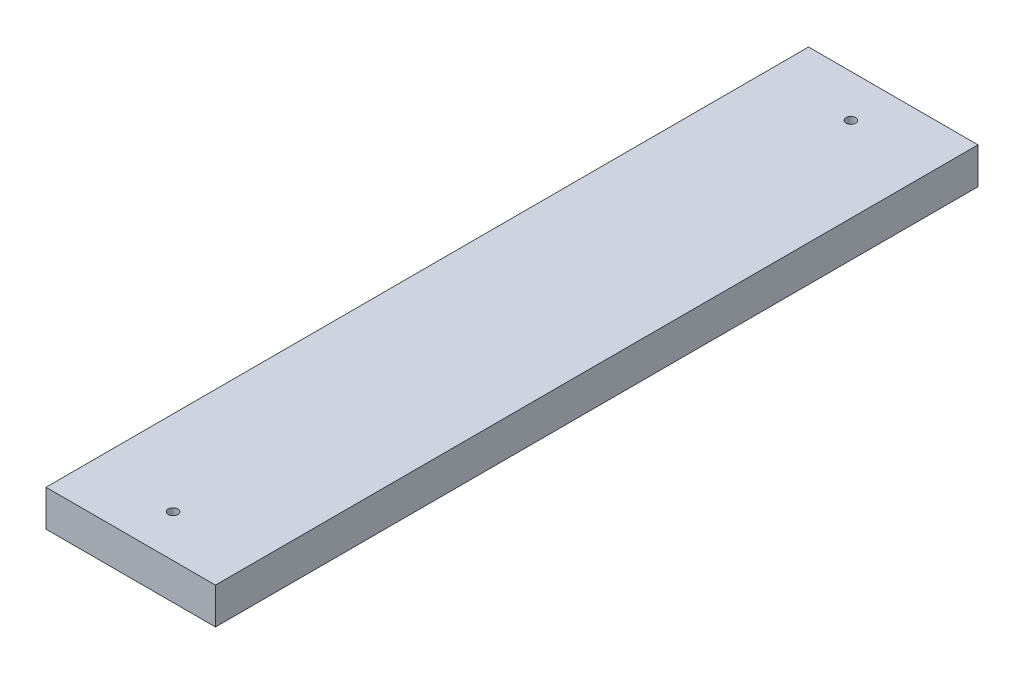
ISO-10303-21;
HEADER;
FILE_DESCRIPTION(('STEP AP214'),'2;1');
FILE_NAME('part.step','',(''),(''),'','','');
FILE_SCHEMA(('AUTOMOTIVE_DESIGN { 1 0 10303 214 1 1 1 1 }'));
ENDSEC;
DATA;
#1=APPLICATION_CONTEXT('core data for automotive mechanical design processes');
#2=APPLICATION_PROTOCOL_DEFINITION('international standard','automotive_design',2000,#1);
#3=PRODUCT_CONTEXT('',#1,'mechanical');
#4=PRODUCT('Part','Part','',(#3));
#5=PRODUCT_RELATED_PRODUCT_CATEGORY('part','',(#4));
#6=PRODUCT_DEFINITION_FORMATION('','',#4);
#7=PRODUCT_DEFINITION_CONTEXT('part definition',#1,'design');
#8=PRODUCT_DEFINITION('design','',#6,#7);
#9=PRODUCT_DEFINITION_SHAPE('','',#8);
#10=(LENGTH_UNIT() NAMED_UNIT(*) SI_UNIT(.MILLI.,.METRE.));
#11=(NAMED_UNIT(*) PLANE_ANGLE_UNIT() SI_UNIT($,.RADIAN.));
#12=(NAMED_UNIT(*) SI_UNIT($,.STERADIAN.) SOLID_ANGLE_UNIT());
#13=UNCERTAINTY_MEASURE_WITH_UNIT(LENGTH_MEASURE(1.E-05),#10,'distance_accuracy_value','');
#14=(GEOMETRIC_REPRESENTATION_CONTEXT(3) GLOBAL_UNCERTAINTY_ASSIGNED_CONTEXT((#13)) GLOBAL_UNIT_ASSIGNED_CONTEXT((#10,
#11,#12)) REPRESENTATION_CONTEXT('',''));
#15=CARTESIAN_POINT('',(0.,0.,0.));
#16=DIRECTION('',(0.,0.,1.));
#17=DIRECTION('',(1.,0.,0.));
#18=AXIS2_PLACEMENT_3D('',#15,#16,#17);
#19=CARTESIAN_POINT('',(0.,15.,0.));
#20=DIRECTION('',(0.,1.,0.));
#21=DIRECTION('',(0.,0.,1.));
#22=AXIS2_PLACEMENT_3D('',#19,#20,#21);
#23=PLANE('',#22);
#24=CARTESIAN_POINT('',(0.,15.,-140.));
#25=DIRECTION('',(0.,1.,0.));
#26=DIRECTION('',(0.,0.,1.));
#27=AXIS2_PLACEMENT_3D('',#24,#25,#26);
#28=CIRCLE('',#27,2.);
#29=CARTESIAN_POINT('',(0.,15.,-138.));
#30=VERTEX_POINT('',#29);
#31=EDGE_CURVE('E100',#30,#30,#28,.T.);
#32=ORIENTED_EDGE('',*,*,#31,.F.);
#33=EDGE_LOOP('',(#32));
#34=FACE_BOUND('',#33,.T.);
#35=DIRECTION('',(0.,0.,-1.));
#36=VECTOR('',#35,1.);
#37=CARTESIAN_POINT('',(35.,15.,-157.5));
#38=LINE('',#37,#36);
#39=CARTESIAN_POINT('',(35.,15.,157.5));
#40=VERTEX_POINT('',#39);
#41=CARTESIAN_POINT('',(35.,15.,-157.5));
#42=VERTEX_POINT('',#41);
#43=EDGE_CURVE('E85',#40,#42,#38,.T.);
#44=ORIENTED_EDGE('',*,*,#43,.T.);
#45=DIRECTION('',(-1.,0.,0.));
#46=VECTOR('',#45,1.);
#47=CARTESIAN_POINT('',(-35.,15.,-157.5));
#48=LINE('',#47,#46);
#49=CARTESIAN_POINT('',(-35.,15.,-157.5));
#50=VERTEX_POINT('',#49);
#51=EDGE_CURVE('E80',#42,#50,#48,.T.);
#52=ORIENTED_EDGE('',*,*,#51,.T.);
#53=DIRECTION('',(0.,0.,1.));
#54=VECTOR('',#53,1.);
#55=CARTESIAN_POINT('',(-35.,15.,-157.5));
#56=LINE('',#55,#54);
#57=CARTESIAN_POINT('',(-35.,15.,157.5));
#58=VERTEX_POINT('',#57);
#59=EDGE_CURVE('E83',#50,#58,#56,.T.);
#60=ORIENTED_EDGE('',*,*,#59,.T.);
#61=DIRECTION('',(1.,0.,0.));
#62=VECTOR('',#61,1.);
#63=CARTESIAN_POINT('',(-35.,15.,157.5));
#64=LINE('',#63,#62);
#65=EDGE_CURVE('E50',#58,#40,#64,.T.);
#66=ORIENTED_EDGE('',*,*,#65,.T.);
#67=EDGE_LOOP('',(#44,#52,#60,#66));
#68=FACE_BOUND('',#67,.T.);
#69=CARTESIAN_POINT('',(0.,15.,140.));
#70=DIRECTION('',(0.,1.,0.));
#71=DIRECTION('',(0.,0.,1.));
#72=AXIS2_PLACEMENT_3D('',#69,#70,#71);
#73=CIRCLE('',#72,2.);
#74=CARTESIAN_POINT('',(0.,15.,142.));
#75=VERTEX_POINT('',#74);
#76=EDGE_CURVE('E115',#75,#75,#73,.T.);
#77=ORIENTED_EDGE('',*,*,#76,.F.);
#78=EDGE_LOOP('',(#77));
#79=FACE_BOUND('',#78,.T.);
#80=ADVANCED_FACE('F33',(#34,#68,#79),#23,.T.);
#81=CARTESIAN_POINT('',(0.,0.,0.));
#82=DIRECTION('',(0.,1.,0.));
#83=DIRECTION('',(0.,0.,1.));
#84=AXIS2_PLACEMENT_3D('',#81,#82,#83);
#85=PLANE('',#84);
#86=DIRECTION('',(0.,0.,-1.));
#87=VECTOR('',#86,1.);
#88=CARTESIAN_POINT('',(35.,0.,-157.5));
#89=LINE('',#88,#87);
#90=CARTESIAN_POINT('',(35.,0.,157.5));
#91=VERTEX_POINT('',#90);
#92=CARTESIAN_POINT('',(35.,0.,-157.5));
#93=VERTEX_POINT('',#92);
#94=EDGE_CURVE('E97',#91,#93,#89,.T.);
#95=ORIENTED_EDGE('',*,*,#94,.F.);
#96=DIRECTION('',(1.,0.,0.));
#97=VECTOR('',#96,1.);
#98=CARTESIAN_POINT('',(-35.,0.,157.5));
#99=LINE('',#98,#97);
#100=CARTESIAN_POINT('',(-35.,0.,157.5));
#101=VERTEX_POINT('',#100);
#102=EDGE_CURVE('E73',#101,#91,#99,.T.);
#103=ORIENTED_EDGE('',*,*,#102,.F.);
#104=DIRECTION('',(0.,0.,1.));
#105=VECTOR('',#104,1.);
#106=CARTESIAN_POINT('',(-35.,0.,-157.5));
#107=LINE('',#106,#105);
#108=CARTESIAN_POINT('',(-35.,0.,-157.5));
#109=VERTEX_POINT('',#108);
#110=EDGE_CURVE('E67',#109,#101,#107,.T.);
#111=ORIENTED_EDGE('',*,*,#110,.F.);
#112=DIRECTION('',(-1.,0.,0.));
#113=VECTOR('',#112,1.);
#114=CARTESIAN_POINT('',(-35.,0.,-157.5));
#115=LINE('',#114,#113);
#116=EDGE_CURVE('E89',#93,#109,#115,.T.);
#117=ORIENTED_EDGE('',*,*,#116,.F.);
#118=EDGE_LOOP('',(#95,#103,#111,#117));
#119=FACE_BOUND('',#118,.T.);
#120=CARTESIAN_POINT('',(0.,0.,-140.));
#121=DIRECTION('',(0.,1.,0.));
#122=DIRECTION('',(0.,0.,1.));
#123=AXIS2_PLACEMENT_3D('',#120,#121,#122);
#124=CIRCLE('',#123,2.);
#125=CARTESIAN_POINT('',(0.,0.,-138.));
#126=VERTEX_POINT('',#125);
#127=EDGE_CURVE('E112',#126,#126,#124,.T.);
#128=ORIENTED_EDGE('',*,*,#127,.T.);
#129=EDGE_LOOP('',(#128));
#130=FACE_BOUND('',#129,.T.);
#131=CARTESIAN_POINT('',(0.,0.,140.));
#132=DIRECTION('',(0.,1.,0.));
#133=DIRECTION('',(0.,0.,1.));
#134=AXIS2_PLACEMENT_3D('',#131,#132,#133);
#135=CIRCLE('',#134,2.);
#136=CARTESIAN_POINT('',(0.,0.,142.));
#137=VERTEX_POINT('',#136);
#138=EDGE_CURVE('E118',#137,#137,#135,.T.);
#139=ORIENTED_EDGE('',*,*,#138,.T.);
#140=EDGE_LOOP('',(#139));
#141=FACE_BOUND('',#140,.T.);
#142=ADVANCED_FACE('F108',(#119,#130,#141),#85,.F.);
#143=CARTESIAN_POINT('',(35.,15.,-157.5));
#144=DIRECTION('',(-1.,0.,0.));
#145=DIRECTION('',(0.,0.,1.));
#146=AXIS2_PLACEMENT_3D('',#143,#144,#145);
#147=PLANE('',#146);
#148=ORIENTED_EDGE('',*,*,#94,.T.);
#149=DIRECTION('',(0.,-1.,0.));
#150=VECTOR('',#149,1.);
#151=CARTESIAN_POINT('',(35.,15.,-157.5));
#152=LINE('',#151,#150);
#153=EDGE_CURVE('E11',#42,#93,#152,.T.);
#154=ORIENTED_EDGE('',*,*,#153,.F.);
#155=ORIENTED_EDGE('',*,*,#43,.F.);
#156=DIRECTION('',(0.,-1.,0.));
#157=VECTOR('',#156,1.);
#158=CARTESIAN_POINT('',(35.,15.,157.5));
#159=LINE('',#158,#157);
#160=EDGE_CURVE('E93',#40,#91,#159,.T.);
#161=ORIENTED_EDGE('',*,*,#160,.T.);
#162=EDGE_LOOP('',(#148,#154,#155,#161));
#163=FACE_BOUND('',#162,.T.);
#164=ADVANCED_FACE('F35',(#163),#147,.F.);
#165=CARTESIAN_POINT('',(-35.,15.,-157.5));
#166=DIRECTION('',(0.,0.,1.));
#167=DIRECTION('',(1.,0.,0.));
#168=AXIS2_PLACEMENT_3D('',#165,#166,#167);
#169=PLANE('',#168);
#170=ORIENTED_EDGE('',*,*,#116,.T.);
#171=DIRECTION('',(0.,-1.,0.));
#172=VECTOR('',#171,1.);
#173=CARTESIAN_POINT('',(-35.,15.,-157.5));
#174=LINE('',#173,#172);
#175=EDGE_CURVE('E42',#50,#109,#174,.T.);
#176=ORIENTED_EDGE('',*,*,#175,.F.);
#177=ORIENTED_EDGE('',*,*,#51,.F.);
#178=ORIENTED_EDGE('',*,*,#153,.T.);
#179=EDGE_LOOP('',(#170,#176,#177,#178));
#180=FACE_BOUND('',#179,.T.);
#181=ADVANCED_FACE('F88',(#180),#169,.F.);
#182=CARTESIAN_POINT('',(-35.,15.,-157.5));
#183=DIRECTION('',(1.,0.,0.));
#184=DIRECTION('',(0.,0.,-1.));
#185=AXIS2_PLACEMENT_3D('',#182,#183,#184);
#186=PLANE('',#185);
#187=ORIENTED_EDGE('',*,*,#110,.T.);
#188=DIRECTION('',(0.,-1.,0.));
#189=VECTOR('',#188,1.);
#190=CARTESIAN_POINT('',(-35.,15.,157.5));
#191=LINE('',#190,#189);
#192=EDGE_CURVE('E90',#58,#101,#191,.T.);
#193=ORIENTED_EDGE('',*,*,#192,.F.);
#194=ORIENTED_EDGE('',*,*,#59,.F.);
#195=ORIENTED_EDGE('',*,*,#175,.T.);
#196=EDGE_LOOP('',(#187,#193,#194,#195));
#197=FACE_BOUND('',#196,.T.);
#198=ADVANCED_FACE('F91',(#197),#186,.F.);
#199=CARTESIAN_POINT('',(-35.,15.,157.5));
#200=DIRECTION('',(0.,0.,-1.));
#201=DIRECTION('',(-1.,0.,0.));
#202=AXIS2_PLACEMENT_3D('',#199,#200,#201);
#203=PLANE('',#202);
#204=ORIENTED_EDGE('',*,*,#102,.T.);
#205=ORIENTED_EDGE('',*,*,#160,.F.);
#206=ORIENTED_EDGE('',*,*,#65,.F.);
#207=ORIENTED_EDGE('',*,*,#192,.T.);
#208=EDGE_LOOP('',(#204,#205,#206,#207));
#209=FACE_BOUND('',#208,.T.);
#210=ADVANCED_FACE('F105',(#209),#203,.F.);
#211=CARTESIAN_POINT('',(0.,15.,-140.));
#212=DIRECTION('',(0.,-1.,0.));
#213=DIRECTION('',(0.,0.,-1.));
#214=AXIS2_PLACEMENT_3D('',#211,#212,#213);
#215=CYLINDRICAL_SURFACE('',#214,2.);
#216=ORIENTED_EDGE('',*,*,#31,.T.);
#217=EDGE_LOOP('',(#216));
#218=FACE_BOUND('',#217,.T.);
#219=ORIENTED_EDGE('',*,*,#127,.F.);
#220=EDGE_LOOP('',(#219));
#221=FACE_BOUND('',#220,.T.);
#222=ADVANCED_FACE('F135',(#218,#221),#215,.F.);
#223=CARTESIAN_POINT('',(0.,15.,140.));
#224=DIRECTION('',(0.,-1.,0.));
#225=DIRECTION('',(0.,0.,-1.));
#226=AXIS2_PLACEMENT_3D('',#223,#224,#225);
#227=CYLINDRICAL_SURFACE('',#226,2.);
#228=ORIENTED_EDGE('',*,*,#76,.T.);
#229=EDGE_LOOP('',(#228));
#230=FACE_BOUND('',#229,.T.);
#231=ORIENTED_EDGE('',*,*,#138,.F.);
#232=EDGE_LOOP('',(#231));
#233=FACE_BOUND('',#232,.T.);
#234=ADVANCED_FACE('F124',(#230,#233),#227,.F.);
#235=CLOSED_SHELL('',(#80,#142,#164,#181,#198,#210,#222,#234));
#236=MANIFOLD_SOLID_BREP('B2',#235);
#237=ADVANCED_BREP_SHAPE_REPRESENTATION('',(#18,#236),#14);
#238=SHAPE_DEFINITION_REPRESENTATION(#9,#237);
ENDSEC;
END-ISO-10303-21;
